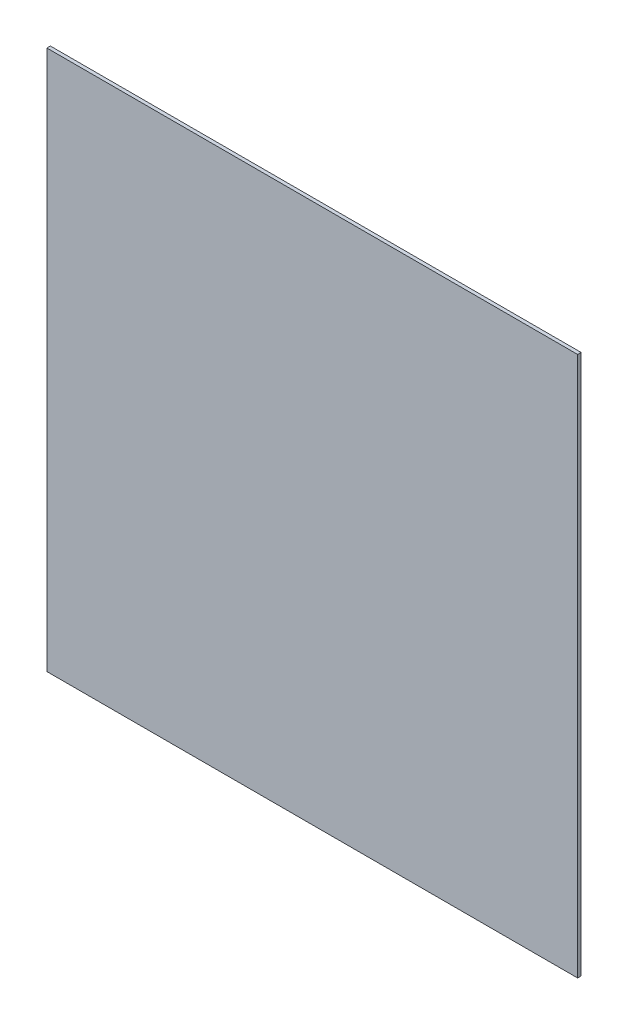
ISO-10303-21;
HEADER;
FILE_DESCRIPTION(('STEP AP214'),'2;1');
FILE_NAME('part.step','',(''),(''),'','','');
FILE_SCHEMA(('AUTOMOTIVE_DESIGN { 1 0 10303 214 1 1 1 1 }'));
ENDSEC;
DATA;
#1=APPLICATION_CONTEXT('core data for automotive mechanical design processes');
#2=APPLICATION_PROTOCOL_DEFINITION('international standard','automotive_design',2000,#1);
#3=PRODUCT_CONTEXT('',#1,'mechanical');
#4=PRODUCT('Part','Part','',(#3));
#5=PRODUCT_RELATED_PRODUCT_CATEGORY('part','',(#4));
#6=PRODUCT_DEFINITION_FORMATION('','',#4);
#7=PRODUCT_DEFINITION_CONTEXT('part definition',#1,'design');
#8=PRODUCT_DEFINITION('design','',#6,#7);
#9=PRODUCT_DEFINITION_SHAPE('','',#8);
#10=(LENGTH_UNIT() NAMED_UNIT(*) SI_UNIT(.MILLI.,.METRE.));
#11=(NAMED_UNIT(*) PLANE_ANGLE_UNIT() SI_UNIT($,.RADIAN.));
#12=(NAMED_UNIT(*) SI_UNIT($,.STERADIAN.) SOLID_ANGLE_UNIT());
#13=UNCERTAINTY_MEASURE_WITH_UNIT(LENGTH_MEASURE(1.E-05),#10,'distance_accuracy_value','');
#14=(GEOMETRIC_REPRESENTATION_CONTEXT(3) GLOBAL_UNCERTAINTY_ASSIGNED_CONTEXT((#13)) GLOBAL_UNIT_ASSIGNED_CONTEXT((#10,
#11,#12)) REPRESENTATION_CONTEXT('',''));
#15=CARTESIAN_POINT('',(0.,0.,0.));
#16=DIRECTION('',(0.,0.,1.));
#17=DIRECTION('',(1.,0.,0.));
#18=AXIS2_PLACEMENT_3D('',#15,#16,#17);
#19=CARTESIAN_POINT('',(0.,0.,3.));
#20=DIRECTION('',(1.,0.,0.));
#21=DIRECTION('',(0.,0.,-1.));
#22=AXIS2_PLACEMENT_3D('',#19,#20,#21);
#23=PLANE('',#22);
#24=DIRECTION('',(0.,-1.,0.));
#25=VECTOR('',#24,1.);
#26=CARTESIAN_POINT('',(0.,0.,0.));
#27=LINE('',#26,#25);
#28=CARTESIAN_POINT('',(0.,464.,0.));
#29=VERTEX_POINT('',#28);
#30=CARTESIAN_POINT('',(0.,0.,0.));
#31=VERTEX_POINT('',#30);
#32=EDGE_CURVE('E109',#29,#31,#27,.T.);
#33=ORIENTED_EDGE('',*,*,#32,.T.);
#34=DIRECTION('',(0.,0.,-1.));
#35=VECTOR('',#34,1.);
#36=CARTESIAN_POINT('',(0.,0.,3.));
#37=LINE('',#36,#35);
#38=CARTESIAN_POINT('',(0.,0.,3.));
#39=VERTEX_POINT('',#38);
#40=EDGE_CURVE('E11',#39,#31,#37,.T.);
#41=ORIENTED_EDGE('',*,*,#40,.F.);
#42=DIRECTION('',(0.,-1.,0.));
#43=VECTOR('',#42,1.);
#44=CARTESIAN_POINT('',(0.,0.,3.));
#45=LINE('',#44,#43);
#46=CARTESIAN_POINT('',(0.,464.,3.));
#47=VERTEX_POINT('',#46);
#48=EDGE_CURVE('E93',#47,#39,#45,.T.);
#49=ORIENTED_EDGE('',*,*,#48,.F.);
#50=DIRECTION('',(0.,0.,-1.));
#51=VECTOR('',#50,1.);
#52=CARTESIAN_POINT('',(0.,464.,3.));
#53=LINE('',#52,#51);
#54=EDGE_CURVE('E105',#47,#29,#53,.T.);
#55=ORIENTED_EDGE('',*,*,#54,.T.);
#56=EDGE_LOOP('',(#33,#41,#49,#55));
#57=FACE_BOUND('',#56,.T.);
#58=ADVANCED_FACE('F41',(#57),#23,.F.);
#59=CARTESIAN_POINT('',(0.,0.,3.));
#60=DIRECTION('',(0.,1.,0.));
#61=DIRECTION('',(0.,0.,1.));
#62=AXIS2_PLACEMENT_3D('',#59,#60,#61);
#63=PLANE('',#62);
#64=DIRECTION('',(1.,0.,0.));
#65=VECTOR('',#64,1.);
#66=CARTESIAN_POINT('',(0.,0.,0.));
#67=LINE('',#66,#65);
#68=CARTESIAN_POINT('',(456.,0.,0.));
#69=VERTEX_POINT('',#68);
#70=EDGE_CURVE('E98',#31,#69,#67,.T.);
#71=ORIENTED_EDGE('',*,*,#70,.T.);
#72=DIRECTION('',(0.,0.,-1.));
#73=VECTOR('',#72,1.);
#74=CARTESIAN_POINT('',(456.,0.,3.));
#75=LINE('',#74,#73);
#76=CARTESIAN_POINT('',(456.,0.,3.));
#77=VERTEX_POINT('',#76);
#78=EDGE_CURVE('E50',#77,#69,#75,.T.);
#79=ORIENTED_EDGE('',*,*,#78,.F.);
#80=DIRECTION('',(1.,0.,0.));
#81=VECTOR('',#80,1.);
#82=CARTESIAN_POINT('',(0.,0.,3.));
#83=LINE('',#82,#81);
#84=EDGE_CURVE('E88',#39,#77,#83,.T.);
#85=ORIENTED_EDGE('',*,*,#84,.F.);
#86=ORIENTED_EDGE('',*,*,#40,.T.);
#87=EDGE_LOOP('',(#71,#79,#85,#86));
#88=FACE_BOUND('',#87,.T.);
#89=ADVANCED_FACE('F97',(#88),#63,.F.);
#90=CARTESIAN_POINT('',(456.,0.,3.));
#91=DIRECTION('',(-1.,0.,0.));
#92=DIRECTION('',(0.,0.,1.));
#93=AXIS2_PLACEMENT_3D('',#90,#91,#92);
#94=PLANE('',#93);
#95=DIRECTION('',(0.,1.,0.));
#96=VECTOR('',#95,1.);
#97=CARTESIAN_POINT('',(456.,0.,0.));
#98=LINE('',#97,#96);
#99=CARTESIAN_POINT('',(456.,464.,0.));
#100=VERTEX_POINT('',#99);
#101=EDGE_CURVE('E75',#69,#100,#98,.T.);
#102=ORIENTED_EDGE('',*,*,#101,.T.);
#103=DIRECTION('',(0.,0.,-1.));
#104=VECTOR('',#103,1.);
#105=CARTESIAN_POINT('',(456.,464.,3.));
#106=LINE('',#105,#104);
#107=CARTESIAN_POINT('',(456.,464.,3.));
#108=VERTEX_POINT('',#107);
#109=EDGE_CURVE('E100',#108,#100,#106,.T.);
#110=ORIENTED_EDGE('',*,*,#109,.F.);
#111=DIRECTION('',(0.,1.,0.));
#112=VECTOR('',#111,1.);
#113=CARTESIAN_POINT('',(456.,0.,3.));
#114=LINE('',#113,#112);
#115=EDGE_CURVE('E91',#77,#108,#114,.T.);
#116=ORIENTED_EDGE('',*,*,#115,.F.);
#117=ORIENTED_EDGE('',*,*,#78,.T.);
#118=EDGE_LOOP('',(#102,#110,#116,#117));
#119=FACE_BOUND('',#118,.T.);
#120=ADVANCED_FACE('F101',(#119),#94,.F.);
#121=CARTESIAN_POINT('',(0.,464.,3.));
#122=DIRECTION('',(0.,-1.,0.));
#123=DIRECTION('',(0.,0.,-1.));
#124=AXIS2_PLACEMENT_3D('',#121,#122,#123);
#125=PLANE('',#124);
#126=DIRECTION('',(-1.,0.,0.));
#127=VECTOR('',#126,1.);
#128=CARTESIAN_POINT('',(0.,464.,0.));
#129=LINE('',#128,#127);
#130=EDGE_CURVE('E81',#100,#29,#129,.T.);
#131=ORIENTED_EDGE('',*,*,#130,.T.);
#132=ORIENTED_EDGE('',*,*,#54,.F.);
#133=DIRECTION('',(-1.,0.,0.));
#134=VECTOR('',#133,1.);
#135=CARTESIAN_POINT('',(0.,464.,3.));
#136=LINE('',#135,#134);
#137=EDGE_CURVE('E58',#108,#47,#136,.T.);
#138=ORIENTED_EDGE('',*,*,#137,.F.);
#139=ORIENTED_EDGE('',*,*,#109,.T.);
#140=EDGE_LOOP('',(#131,#132,#138,#139));
#141=FACE_BOUND('',#140,.T.);
#142=ADVANCED_FACE('F122',(#141),#125,.F.);
#143=CARTESIAN_POINT('',(0.,0.,3.));
#144=DIRECTION('',(0.,0.,-1.));
#145=DIRECTION('',(-1.,0.,0.));
#146=AXIS2_PLACEMENT_3D('',#143,#144,#145);
#147=PLANE('',#146);
#148=ORIENTED_EDGE('',*,*,#48,.T.);
#149=ORIENTED_EDGE('',*,*,#84,.T.);
#150=ORIENTED_EDGE('',*,*,#115,.T.);
#151=ORIENTED_EDGE('',*,*,#137,.T.);
#152=EDGE_LOOP('',(#148,#149,#150,#151));
#153=FACE_BOUND('',#152,.T.);
#154=ADVANCED_FACE('F89',(#153),#147,.F.);
#155=CARTESIAN_POINT('',(0.,0.,0.));
#156=DIRECTION('',(0.,0.,-1.));
#157=DIRECTION('',(-1.,0.,0.));
#158=AXIS2_PLACEMENT_3D('',#155,#156,#157);
#159=PLANE('',#158);
#160=ORIENTED_EDGE('',*,*,#32,.F.);
#161=ORIENTED_EDGE('',*,*,#130,.F.);
#162=ORIENTED_EDGE('',*,*,#101,.F.);
#163=ORIENTED_EDGE('',*,*,#70,.F.);
#164=EDGE_LOOP('',(#160,#161,#162,#163));
#165=FACE_BOUND('',#164,.T.);
#166=ADVANCED_FACE('F125',(#165),#159,.T.);
#167=CLOSED_SHELL('',(#58,#89,#120,#142,#154,#166));
#168=MANIFOLD_SOLID_BREP('B2',#167);
#169=ADVANCED_BREP_SHAPE_REPRESENTATION('',(#18,#168),#14);
#170=SHAPE_DEFINITION_REPRESENTATION(#9,#169);
ENDSEC;
END-ISO-10303-21;
